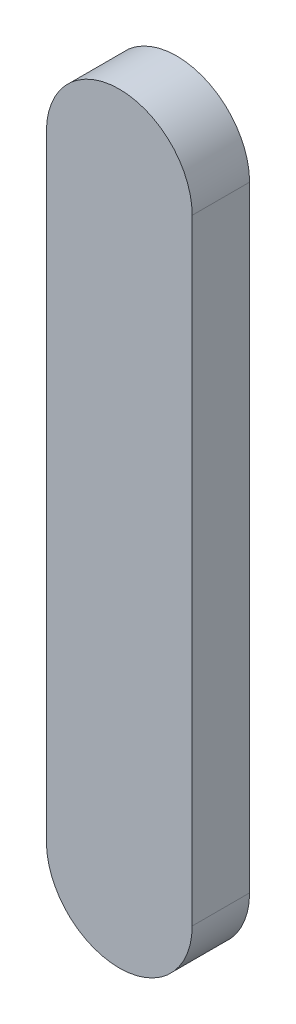
ISO-10303-21;
HEADER;
FILE_DESCRIPTION(('STEP AP214'),'2;1');
FILE_NAME('part.step','',(''),(''),'','','');
FILE_SCHEMA(('AUTOMOTIVE_DESIGN { 1 0 10303 214 1 1 1 1 }'));
ENDSEC;
DATA;
#1=APPLICATION_CONTEXT('core data for automotive mechanical design processes');
#2=APPLICATION_PROTOCOL_DEFINITION('international standard','automotive_design',2000,#1);
#3=PRODUCT_CONTEXT('',#1,'mechanical');
#4=PRODUCT('Part','Part','',(#3));
#5=PRODUCT_RELATED_PRODUCT_CATEGORY('part','',(#4));
#6=PRODUCT_DEFINITION_FORMATION('','',#4);
#7=PRODUCT_DEFINITION_CONTEXT('part definition',#1,'design');
#8=PRODUCT_DEFINITION('design','',#6,#7);
#9=PRODUCT_DEFINITION_SHAPE('','',#8);
#10=(LENGTH_UNIT() NAMED_UNIT(*) SI_UNIT(.MILLI.,.METRE.));
#11=(NAMED_UNIT(*) PLANE_ANGLE_UNIT() SI_UNIT($,.RADIAN.));
#12=(NAMED_UNIT(*) SI_UNIT($,.STERADIAN.) SOLID_ANGLE_UNIT());
#13=UNCERTAINTY_MEASURE_WITH_UNIT(LENGTH_MEASURE(1.E-05),#10,'distance_accuracy_value','');
#14=(GEOMETRIC_REPRESENTATION_CONTEXT(3) GLOBAL_UNCERTAINTY_ASSIGNED_CONTEXT((#13)) GLOBAL_UNIT_ASSIGNED_CONTEXT((#10,
#11,#12)) REPRESENTATION_CONTEXT('',''));
#15=CARTESIAN_POINT('',(0.,0.,0.));
#16=DIRECTION('',(0.,0.,1.));
#17=DIRECTION('',(1.,0.,0.));
#18=AXIS2_PLACEMENT_3D('',#15,#16,#17);
#19=CARTESIAN_POINT('',(150.56550024,67.38050024,0.));
#20=DIRECTION('',(-1.,0.,0.));
#21=DIRECTION('',(0.,1.,0.));
#22=AXIS2_PLACEMENT_3D('',#19,#20,#21);
#23=PLANE('',#22);
#24=DIRECTION('',(0.,1.,0.));
#25=VECTOR('',#24,1.);
#26=CARTESIAN_POINT('',(150.56550024,67.38050024,0.1999996));
#27=LINE('',#26,#25);
#28=CARTESIAN_POINT('',(150.56550024,67.38050024,0.1999996));
#29=VERTEX_POINT('',#28);
#30=CARTESIAN_POINT('',(150.56550024,69.52549976,0.1999996));
#31=VERTEX_POINT('',#30);
#32=EDGE_CURVE('E11',#29,#31,#27,.T.);
#33=ORIENTED_EDGE('',*,*,#32,.F.);
#34=DIRECTION('',(0.,0.,1.));
#35=VECTOR('',#34,1.);
#36=CARTESIAN_POINT('',(150.56550024,67.38050024,0.));
#37=LINE('',#36,#35);
#38=CARTESIAN_POINT('',(150.56550024,67.38050024,0.));
#39=VERTEX_POINT('',#38);
#40=EDGE_CURVE('E24',#39,#29,#37,.T.);
#41=ORIENTED_EDGE('',*,*,#40,.F.);
#42=DIRECTION('',(0.,1.,0.));
#43=VECTOR('',#42,1.);
#44=CARTESIAN_POINT('',(150.56550024,67.38050024,0.));
#45=LINE('',#44,#43);
#46=CARTESIAN_POINT('',(150.56550024,69.52549976,0.));
#47=VERTEX_POINT('',#46);
#48=EDGE_CURVE('E75',#39,#47,#45,.T.);
#49=ORIENTED_EDGE('',*,*,#48,.T.);
#50=DIRECTION('',(0.,0.,1.));
#51=VECTOR('',#50,1.);
#52=CARTESIAN_POINT('',(150.56550024,69.52549976,0.));
#53=LINE('',#52,#51);
#54=EDGE_CURVE('E37',#47,#31,#53,.T.);
#55=ORIENTED_EDGE('',*,*,#54,.T.);
#56=EDGE_LOOP('',(#33,#41,#49,#55));
#57=FACE_BOUND('',#56,.T.);
#58=ADVANCED_FACE('F17',(#57),#23,.F.);
#59=CARTESIAN_POINT('',(150.31150024,69.52549976,0.));
#60=DIRECTION('',(0.,0.,-1.));
#61=DIRECTION('',(1.,0.,0.));
#62=AXIS2_PLACEMENT_3D('',#59,#60,#61);
#63=CYLINDRICAL_SURFACE('',#62,0.253999999999995);
#64=CARTESIAN_POINT('',(150.31150024,69.52549976,0.1999996));
#65=DIRECTION('',(0.,0.,1.));
#66=DIRECTION('',(1.,0.,0.));
#67=AXIS2_PLACEMENT_3D('',#64,#65,#66);
#68=CIRCLE('',#67,0.253999999999995);
#69=CARTESIAN_POINT('',(150.05750024,69.52549976,0.1999996));
#70=VERTEX_POINT('',#69);
#71=EDGE_CURVE('E83',#31,#70,#68,.T.);
#72=ORIENTED_EDGE('',*,*,#71,.F.);
#73=ORIENTED_EDGE('',*,*,#54,.F.);
#74=CARTESIAN_POINT('',(150.31150024,69.52549976,0.));
#75=DIRECTION('',(0.,0.,1.));
#76=DIRECTION('',(1.,0.,0.));
#77=AXIS2_PLACEMENT_3D('',#74,#75,#76);
#78=CIRCLE('',#77,0.253999999999995);
#79=CARTESIAN_POINT('',(150.05750024,69.52549976,0.));
#80=VERTEX_POINT('',#79);
#81=EDGE_CURVE('E81',#47,#80,#78,.T.);
#82=ORIENTED_EDGE('',*,*,#81,.T.);
#83=DIRECTION('',(0.,0.,1.));
#84=VECTOR('',#83,1.);
#85=CARTESIAN_POINT('',(150.05750024,69.52549976,0.));
#86=LINE('',#85,#84);
#87=EDGE_CURVE('E67',#80,#70,#86,.T.);
#88=ORIENTED_EDGE('',*,*,#87,.T.);
#89=EDGE_LOOP('',(#72,#73,#82,#88));
#90=FACE_BOUND('',#89,.T.);
#91=ADVANCED_FACE('F89',(#90),#63,.T.);
#92=CARTESIAN_POINT('',(150.05750024,69.52549976,0.));
#93=DIRECTION('',(1.,0.,0.));
#94=DIRECTION('',(0.,-1.,0.));
#95=AXIS2_PLACEMENT_3D('',#92,#93,#94);
#96=PLANE('',#95);
#97=DIRECTION('',(0.,-1.,0.));
#98=VECTOR('',#97,1.);
#99=CARTESIAN_POINT('',(150.05750024,69.52549976,0.1999996));
#100=LINE('',#99,#98);
#101=CARTESIAN_POINT('',(150.05750024,67.38050024,0.1999996));
#102=VERTEX_POINT('',#101);
#103=EDGE_CURVE('E71',#70,#102,#100,.T.);
#104=ORIENTED_EDGE('',*,*,#103,.F.);
#105=ORIENTED_EDGE('',*,*,#87,.F.);
#106=DIRECTION('',(0.,-1.,0.));
#107=VECTOR('',#106,1.);
#108=CARTESIAN_POINT('',(150.05750024,69.52549976,0.));
#109=LINE('',#108,#107);
#110=CARTESIAN_POINT('',(150.05750024,67.38050024,0.));
#111=VERTEX_POINT('',#110);
#112=EDGE_CURVE('E63',#80,#111,#109,.T.);
#113=ORIENTED_EDGE('',*,*,#112,.T.);
#114=DIRECTION('',(0.,0.,1.));
#115=VECTOR('',#114,1.);
#116=CARTESIAN_POINT('',(150.05750024,67.38050024,0.));
#117=LINE('',#116,#115);
#118=EDGE_CURVE('E53',#111,#102,#117,.T.);
#119=ORIENTED_EDGE('',*,*,#118,.T.);
#120=EDGE_LOOP('',(#104,#105,#113,#119));
#121=FACE_BOUND('',#120,.T.);
#122=ADVANCED_FACE('F66',(#121),#96,.F.);
#123=CARTESIAN_POINT('',(150.31150024,67.38050024,0.));
#124=DIRECTION('',(0.,0.,-1.));
#125=DIRECTION('',(-1.,0.,0.));
#126=AXIS2_PLACEMENT_3D('',#123,#124,#125);
#127=CYLINDRICAL_SURFACE('',#126,0.253999999999995);
#128=CARTESIAN_POINT('',(150.31150024,67.38050024,0.1999996));
#129=DIRECTION('',(0.,0.,1.));
#130=DIRECTION('',(-1.,0.,0.));
#131=AXIS2_PLACEMENT_3D('',#128,#129,#130);
#132=CIRCLE('',#131,0.253999999999995);
#133=EDGE_CURVE('E59',#102,#29,#132,.T.);
#134=ORIENTED_EDGE('',*,*,#133,.F.);
#135=ORIENTED_EDGE('',*,*,#118,.F.);
#136=CARTESIAN_POINT('',(150.31150024,67.38050024,0.));
#137=DIRECTION('',(0.,0.,1.));
#138=DIRECTION('',(-1.,0.,0.));
#139=AXIS2_PLACEMENT_3D('',#136,#137,#138);
#140=CIRCLE('',#139,0.253999999999995);
#141=EDGE_CURVE('E57',#111,#39,#140,.T.);
#142=ORIENTED_EDGE('',*,*,#141,.T.);
#143=ORIENTED_EDGE('',*,*,#40,.T.);
#144=EDGE_LOOP('',(#134,#135,#142,#143));
#145=FACE_BOUND('',#144,.T.);
#146=ADVANCED_FACE('F55',(#145),#127,.T.);
#147=CARTESIAN_POINT('',(150.56550024,67.38050024,0.));
#148=DIRECTION('',(0.,0.,-1.));
#149=DIRECTION('',(-1.,0.,0.));
#150=AXIS2_PLACEMENT_3D('',#147,#148,#149);
#151=PLANE('',#150);
#152=ORIENTED_EDGE('',*,*,#141,.F.);
#153=ORIENTED_EDGE('',*,*,#112,.F.);
#154=ORIENTED_EDGE('',*,*,#81,.F.);
#155=ORIENTED_EDGE('',*,*,#48,.F.);
#156=EDGE_LOOP('',(#152,#153,#154,#155));
#157=FACE_BOUND('',#156,.T.);
#158=ADVANCED_FACE('F74',(#157),#151,.T.);
#159=CARTESIAN_POINT('',(150.56550024,67.38050024,0.1999996));
#160=DIRECTION('',(0.,0.,-1.));
#161=DIRECTION('',(-1.,0.,0.));
#162=AXIS2_PLACEMENT_3D('',#159,#160,#161);
#163=PLANE('',#162);
#164=ORIENTED_EDGE('',*,*,#32,.T.);
#165=ORIENTED_EDGE('',*,*,#71,.T.);
#166=ORIENTED_EDGE('',*,*,#103,.T.);
#167=ORIENTED_EDGE('',*,*,#133,.T.);
#168=EDGE_LOOP('',(#164,#165,#166,#167));
#169=FACE_BOUND('',#168,.T.);
#170=ADVANCED_FACE('F91',(#169),#163,.F.);
#171=CLOSED_SHELL('',(#58,#91,#122,#146,#158,#170));
#172=MANIFOLD_SOLID_BREP('B1',#171);
#173=ADVANCED_BREP_SHAPE_REPRESENTATION('',(#18,#172),#14);
#174=SHAPE_DEFINITION_REPRESENTATION(#9,#173);
ENDSEC;
END-ISO-10303-21;
